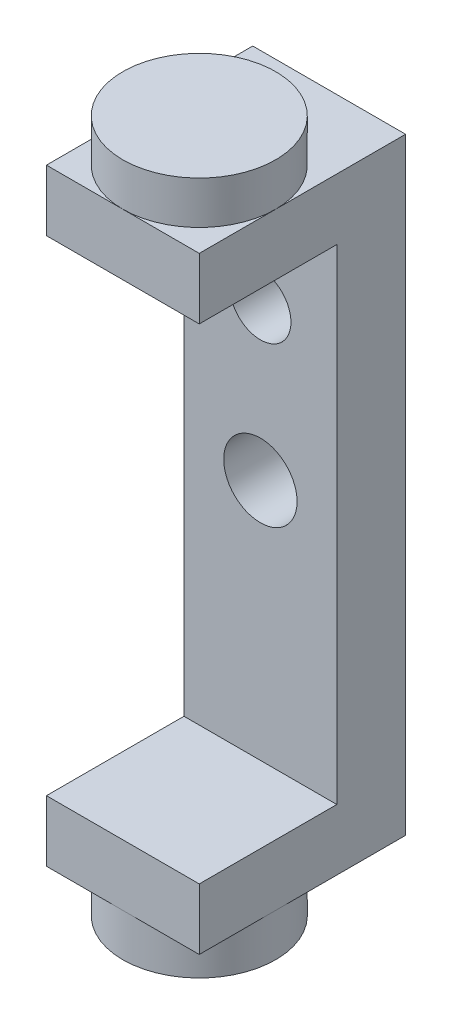
ISO-10303-21;
HEADER;
FILE_DESCRIPTION(('STEP AP214'),'2;1');
FILE_NAME('part.step','',(''),(''),'','','');
FILE_SCHEMA(('AUTOMOTIVE_DESIGN { 1 0 10303 214 1 1 1 1 }'));
ENDSEC;
DATA;
#1=APPLICATION_CONTEXT('core data for automotive mechanical design processes');
#2=APPLICATION_PROTOCOL_DEFINITION('international standard','automotive_design',2000,#1);
#3=PRODUCT_CONTEXT('',#1,'mechanical');
#4=PRODUCT('Part','Part','',(#3));
#5=PRODUCT_RELATED_PRODUCT_CATEGORY('part','',(#4));
#6=PRODUCT_DEFINITION_FORMATION('','',#4);
#7=PRODUCT_DEFINITION_CONTEXT('part definition',#1,'design');
#8=PRODUCT_DEFINITION('design','',#6,#7);
#9=PRODUCT_DEFINITION_SHAPE('','',#8);
#10=(LENGTH_UNIT() NAMED_UNIT(*) SI_UNIT(.MILLI.,.METRE.));
#11=(NAMED_UNIT(*) PLANE_ANGLE_UNIT() SI_UNIT($,.RADIAN.));
#12=(NAMED_UNIT(*) SI_UNIT($,.STERADIAN.) SOLID_ANGLE_UNIT());
#13=UNCERTAINTY_MEASURE_WITH_UNIT(LENGTH_MEASURE(1.E-05),#10,'distance_accuracy_value','');
#14=(GEOMETRIC_REPRESENTATION_CONTEXT(3) GLOBAL_UNCERTAINTY_ASSIGNED_CONTEXT((#13)) GLOBAL_UNIT_ASSIGNED_CONTEXT((#10,
#11,#12)) REPRESENTATION_CONTEXT('',''));
#15=CARTESIAN_POINT('',(0.,0.,0.));
#16=DIRECTION('',(0.,0.,1.));
#17=DIRECTION('',(1.,0.,0.));
#18=AXIS2_PLACEMENT_3D('',#15,#16,#17);
#19=CARTESIAN_POINT('',(2.5,-9.93292427062988,2.25));
#20=DIRECTION('',(0.,1.,0.));
#21=DIRECTION('',(0.,0.,1.));
#22=AXIS2_PLACEMENT_3D('',#19,#20,#21);
#23=PLANE('',#22);
#24=DIRECTION('',(1.,0.,0.));
#25=VECTOR('',#24,1.);
#26=CARTESIAN_POINT('',(2.5,-9.93292427062988,6.75));
#27=LINE('',#26,#25);
#28=CARTESIAN_POINT('',(0.,-9.93292427062988,6.75));
#29=VERTEX_POINT('',#28);
#30=CARTESIAN_POINT('',(2.5,-9.93292427062988,6.75));
#31=VERTEX_POINT('',#30);
#32=EDGE_CURVE('E133',#29,#31,#27,.T.);
#33=ORIENTED_EDGE('',*,*,#32,.F.);
#34=CARTESIAN_POINT('',(0.,-9.93292427062988,4.25));
#35=DIRECTION('',(0.,1.,0.));
#36=DIRECTION('',(0.,0.,1.));
#37=AXIS2_PLACEMENT_3D('',#34,#35,#36);
#38=CIRCLE('',#37,2.5);
#39=CARTESIAN_POINT('',(2.5,-9.93292427062988,4.25));
#40=VERTEX_POINT('',#39);
#41=EDGE_CURVE('E51',#29,#40,#38,.T.);
#42=ORIENTED_EDGE('',*,*,#41,.T.);
#43=DIRECTION('',(0.,0.,-1.));
#44=VECTOR('',#43,1.);
#45=CARTESIAN_POINT('',(2.5,-9.93292427062988,2.25));
#46=LINE('',#45,#44);
#47=EDGE_CURVE('E131',#31,#40,#46,.T.);
#48=ORIENTED_EDGE('',*,*,#47,.F.);
#49=EDGE_LOOP('',(#33,#42,#48));
#50=FACE_BOUND('',#49,.T.);
#51=ADVANCED_FACE('F39',(#50),#23,.F.);
#52=CARTESIAN_POINT('',(2.5,-9.93292427062988,0.));
#53=VERTEX_POINT('',#52);
#54=EDGE_CURVE('E138',#40,#53,#46,.T.);
#55=ORIENTED_EDGE('',*,*,#54,.F.);
#56=CARTESIAN_POINT('',(-2.5,-9.93292427062988,4.25));
#57=VERTEX_POINT('',#56);
#58=EDGE_CURVE('E11',#40,#57,#38,.T.);
#59=ORIENTED_EDGE('',*,*,#58,.T.);
#60=DIRECTION('',(0.,0.,-1.));
#61=VECTOR('',#60,1.);
#62=CARTESIAN_POINT('',(-2.5,-9.93292427062988,2.25));
#63=LINE('',#62,#61);
#64=CARTESIAN_POINT('',(-2.5,-9.93292427062988,0.));
#65=VERTEX_POINT('',#64);
#66=EDGE_CURVE('E152',#57,#65,#63,.T.);
#67=ORIENTED_EDGE('',*,*,#66,.T.);
#68=DIRECTION('',(1.,0.,0.));
#69=VECTOR('',#68,1.);
#70=CARTESIAN_POINT('',(2.5,-9.93292427062988,0.));
#71=LINE('',#70,#69);
#72=EDGE_CURVE('E141',#65,#53,#71,.T.);
#73=ORIENTED_EDGE('',*,*,#72,.T.);
#74=EDGE_LOOP('',(#55,#59,#67,#73));
#75=FACE_BOUND('',#74,.T.);
#76=ADVANCED_FACE('F139',(#75),#23,.F.);
#77=CARTESIAN_POINT('',(2.5,9.93292427062988,2.25));
#78=DIRECTION('',(0.,-1.,0.));
#79=DIRECTION('',(0.,0.,-1.));
#80=AXIS2_PLACEMENT_3D('',#77,#78,#79);
#81=PLANE('',#80);
#82=CARTESIAN_POINT('',(0.,9.93292427062988,4.25));
#83=DIRECTION('',(0.,1.,0.));
#84=DIRECTION('',(0.,0.,1.));
#85=AXIS2_PLACEMENT_3D('',#82,#83,#84);
#86=CIRCLE('',#85,2.5);
#87=CARTESIAN_POINT('',(0.,9.93292427062988,6.75));
#88=VERTEX_POINT('',#87);
#89=CARTESIAN_POINT('',(2.5,9.93292427062988,4.25));
#90=VERTEX_POINT('',#89);
#91=EDGE_CURVE('E261',#88,#90,#86,.T.);
#92=ORIENTED_EDGE('',*,*,#91,.F.);
#93=DIRECTION('',(-1.,0.,0.));
#94=VECTOR('',#93,1.);
#95=CARTESIAN_POINT('',(2.5,9.93292427062988,6.75));
#96=LINE('',#95,#94);
#97=CARTESIAN_POINT('',(2.5,9.93292427062988,6.75));
#98=VERTEX_POINT('',#97);
#99=EDGE_CURVE('E230',#98,#88,#96,.T.);
#100=ORIENTED_EDGE('',*,*,#99,.F.);
#101=DIRECTION('',(0.,0.,-1.));
#102=VECTOR('',#101,1.);
#103=CARTESIAN_POINT('',(2.5,9.93292427062988,2.25));
#104=LINE('',#103,#102);
#105=EDGE_CURVE('E43',#98,#90,#104,.T.);
#106=ORIENTED_EDGE('',*,*,#105,.T.);
#107=EDGE_LOOP('',(#92,#100,#106));
#108=FACE_BOUND('',#107,.T.);
#109=ADVANCED_FACE('F288',(#108),#81,.F.);
#110=CARTESIAN_POINT('',(-2.5,9.93292427062988,4.25));
#111=VERTEX_POINT('',#110);
#112=EDGE_CURVE('E65',#90,#111,#86,.T.);
#113=ORIENTED_EDGE('',*,*,#112,.F.);
#114=CARTESIAN_POINT('',(2.5,9.93292427062988,0.));
#115=VERTEX_POINT('',#114);
#116=EDGE_CURVE('E164',#90,#115,#104,.T.);
#117=ORIENTED_EDGE('',*,*,#116,.T.);
#118=DIRECTION('',(-1.,0.,0.));
#119=VECTOR('',#118,1.);
#120=CARTESIAN_POINT('',(2.5,9.93292427062988,0.));
#121=LINE('',#120,#119);
#122=CARTESIAN_POINT('',(-2.5,9.93292427062988,0.));
#123=VERTEX_POINT('',#122);
#124=EDGE_CURVE('E176',#115,#123,#121,.T.);
#125=ORIENTED_EDGE('',*,*,#124,.T.);
#126=DIRECTION('',(0.,0.,-1.));
#127=VECTOR('',#126,1.);
#128=CARTESIAN_POINT('',(-2.5,9.93292427062988,2.25));
#129=LINE('',#128,#127);
#130=EDGE_CURVE('E160',#111,#123,#129,.T.);
#131=ORIENTED_EDGE('',*,*,#130,.F.);
#132=EDGE_LOOP('',(#113,#117,#125,#131));
#133=FACE_BOUND('',#132,.T.);
#134=ADVANCED_FACE('F177',(#133),#81,.F.);
#135=CARTESIAN_POINT('',(0.,0.,2.25));
#136=DIRECTION('',(0.,0.,-1.));
#137=DIRECTION('',(-1.,0.,0.));
#138=AXIS2_PLACEMENT_3D('',#135,#136,#137);
#139=PLANE('',#138);
#140=CARTESIAN_POINT('',(-3.5312787199579E-08,-2.51143155479815E-08,2.25));
#141=DIRECTION('',(0.,0.,1.));
#142=DIRECTION('',(1.,0.,0.));
#143=AXIS2_PLACEMENT_3D('',#140,#141,#142);
#144=CIRCLE('',#143,1.20000001650841);
#145=CARTESIAN_POINT('',(1.19999998119562,-2.51143155479815E-08,2.25));
#146=VERTEX_POINT('',#145);
#147=EDGE_CURVE('E190',#146,#146,#144,.T.);
#148=ORIENTED_EDGE('',*,*,#147,.F.);
#149=EDGE_LOOP('',(#148));
#150=FACE_BOUND('',#149,.T.);
#151=CARTESIAN_POINT('',(1.04070406819709E-07,4.98252010345459,2.25));
#152=DIRECTION('',(0.,0.,1.));
#153=DIRECTION('',(1.,0.,0.));
#154=AXIS2_PLACEMENT_3D('',#151,#152,#153);
#155=CIRCLE('',#154,1.00000000077066);
#156=CARTESIAN_POINT('',(1.00000010484107,4.98252010345459,2.25));
#157=VERTEX_POINT('',#156);
#158=EDGE_CURVE('E199',#157,#157,#155,.T.);
#159=ORIENTED_EDGE('',*,*,#158,.F.);
#160=EDGE_LOOP('',(#159));
#161=FACE_BOUND('',#160,.T.);
#162=DIRECTION('',(-1.,0.,0.));
#163=VECTOR('',#162,1.);
#164=CARTESIAN_POINT('',(2.5,-7.93292427062988,2.25));
#165=LINE('',#164,#163);
#166=CARTESIAN_POINT('',(2.5,-7.93292427062988,2.25));
#167=VERTEX_POINT('',#166);
#168=CARTESIAN_POINT('',(-2.5,-7.93292427062988,2.25));
#169=VERTEX_POINT('',#168);
#170=EDGE_CURVE('E245',#167,#169,#165,.T.);
#171=ORIENTED_EDGE('',*,*,#170,.F.);
#172=DIRECTION('',(0.,1.,0.));
#173=VECTOR('',#172,1.);
#174=CARTESIAN_POINT('',(2.5,9.93292427062988,2.25));
#175=LINE('',#174,#173);
#176=CARTESIAN_POINT('',(2.5,7.93292427062988,2.25));
#177=VERTEX_POINT('',#176);
#178=EDGE_CURVE('E186',#167,#177,#175,.T.);
#179=ORIENTED_EDGE('',*,*,#178,.T.);
#180=DIRECTION('',(1.,0.,0.));
#181=VECTOR('',#180,1.);
#182=CARTESIAN_POINT('',(2.5,7.93292427062988,2.25));
#183=LINE('',#182,#181);
#184=CARTESIAN_POINT('',(-2.5,7.93292427062988,2.25));
#185=VERTEX_POINT('',#184);
#186=EDGE_CURVE('E219',#185,#177,#183,.T.);
#187=ORIENTED_EDGE('',*,*,#186,.F.);
#188=DIRECTION('',(0.,-1.,0.));
#189=VECTOR('',#188,1.);
#190=CARTESIAN_POINT('',(-2.5,9.93292427062988,2.25));
#191=LINE('',#190,#189);
#192=EDGE_CURVE('E146',#185,#169,#191,.T.);
#193=ORIENTED_EDGE('',*,*,#192,.T.);
#194=EDGE_LOOP('',(#171,#179,#187,#193));
#195=FACE_BOUND('',#194,.T.);
#196=ADVANCED_FACE('F353',(#150,#161,#195),#139,.F.);
#197=CARTESIAN_POINT('',(0.,0.,0.));
#198=DIRECTION('',(0.,0.,-1.));
#199=DIRECTION('',(-1.,0.,0.));
#200=AXIS2_PLACEMENT_3D('',#197,#198,#199);
#201=PLANE('',#200);
#202=CARTESIAN_POINT('',(-3.5312787199579E-08,-2.51143155479815E-08,0.));
#203=DIRECTION('',(0.,0.,1.));
#204=DIRECTION('',(1.,0.,0.));
#205=AXIS2_PLACEMENT_3D('',#202,#203,#204);
#206=CIRCLE('',#205,1.20000001650841);
#207=CARTESIAN_POINT('',(1.19999998119562,-2.51143155479815E-08,0.));
#208=VERTEX_POINT('',#207);
#209=EDGE_CURVE('E195',#208,#208,#206,.T.);
#210=ORIENTED_EDGE('',*,*,#209,.T.);
#211=EDGE_LOOP('',(#210));
#212=FACE_BOUND('',#211,.T.);
#213=DIRECTION('',(0.,1.,0.));
#214=VECTOR('',#213,1.);
#215=CARTESIAN_POINT('',(2.5,9.93292427062988,0.));
#216=LINE('',#215,#214);
#217=EDGE_CURVE('E180',#53,#115,#216,.T.);
#218=ORIENTED_EDGE('',*,*,#217,.F.);
#219=ORIENTED_EDGE('',*,*,#72,.F.);
#220=DIRECTION('',(0.,-1.,0.));
#221=VECTOR('',#220,1.);
#222=CARTESIAN_POINT('',(-2.5,9.93292427062988,0.));
#223=LINE('',#222,#221);
#224=EDGE_CURVE('E174',#123,#65,#223,.T.);
#225=ORIENTED_EDGE('',*,*,#224,.F.);
#226=ORIENTED_EDGE('',*,*,#124,.F.);
#227=EDGE_LOOP('',(#218,#219,#225,#226));
#228=FACE_BOUND('',#227,.T.);
#229=CARTESIAN_POINT('',(1.04070406819709E-07,4.98252010345459,0.));
#230=DIRECTION('',(0.,0.,1.));
#231=DIRECTION('',(1.,0.,0.));
#232=AXIS2_PLACEMENT_3D('',#229,#230,#231);
#233=CIRCLE('',#232,1.00000000077066);
#234=CARTESIAN_POINT('',(1.00000010484107,4.98252010345459,0.));
#235=VERTEX_POINT('',#234);
#236=EDGE_CURVE('E203',#235,#235,#233,.T.);
#237=ORIENTED_EDGE('',*,*,#236,.T.);
#238=EDGE_LOOP('',(#237));
#239=FACE_BOUND('',#238,.T.);
#240=ADVANCED_FACE('F182',(#212,#228,#239),#201,.T.);
#241=CARTESIAN_POINT('',(2.5,9.93292427062988,2.25));
#242=DIRECTION('',(-1.,0.,0.));
#243=DIRECTION('',(0.,0.,1.));
#244=AXIS2_PLACEMENT_3D('',#241,#242,#243);
#245=PLANE('',#244);
#246=ORIENTED_EDGE('',*,*,#217,.T.);
#247=ORIENTED_EDGE('',*,*,#116,.F.);
#248=ORIENTED_EDGE('',*,*,#105,.F.);
#249=DIRECTION('',(0.,1.,0.));
#250=VECTOR('',#249,1.);
#251=CARTESIAN_POINT('',(2.5,9.93292427062988,6.75));
#252=LINE('',#251,#250);
#253=CARTESIAN_POINT('',(2.5,7.93292427062988,6.75));
#254=VERTEX_POINT('',#253);
#255=EDGE_CURVE('E223',#254,#98,#252,.T.);
#256=ORIENTED_EDGE('',*,*,#255,.F.);
#257=DIRECTION('',(0.,0.,-1.));
#258=VECTOR('',#257,1.);
#259=CARTESIAN_POINT('',(2.5,7.93292427062988,6.75));
#260=LINE('',#259,#258);
#261=EDGE_CURVE('E214',#254,#177,#260,.T.);
#262=ORIENTED_EDGE('',*,*,#261,.T.);
#263=ORIENTED_EDGE('',*,*,#178,.F.);
#264=DIRECTION('',(0.,0.,-1.));
#265=VECTOR('',#264,1.);
#266=CARTESIAN_POINT('',(2.5,-7.93292427062988,6.75));
#267=LINE('',#266,#265);
#268=CARTESIAN_POINT('',(2.5,-7.93292427062988,6.75));
#269=VERTEX_POINT('',#268);
#270=EDGE_CURVE('E224',#269,#167,#267,.T.);
#271=ORIENTED_EDGE('',*,*,#270,.F.);
#272=DIRECTION('',(0.,1.,0.));
#273=VECTOR('',#272,1.);
#274=CARTESIAN_POINT('',(2.5,-9.93292427062988,6.75));
#275=LINE('',#274,#273);
#276=EDGE_CURVE('E150',#31,#269,#275,.T.);
#277=ORIENTED_EDGE('',*,*,#276,.F.);
#278=ORIENTED_EDGE('',*,*,#47,.T.);
#279=ORIENTED_EDGE('',*,*,#54,.T.);
#280=EDGE_LOOP('',(#246,#247,#248,#256,#262,#263,#271,#277,#278,#279));
#281=FACE_BOUND('',#280,.T.);
#282=ADVANCED_FACE('F41',(#281),#245,.F.);
#283=EDGE_CURVE('E265',#111,#88,#86,.T.);
#284=ORIENTED_EDGE('',*,*,#283,.F.);
#285=CARTESIAN_POINT('',(-2.5,9.93292427062988,6.75));
#286=VERTEX_POINT('',#285);
#287=EDGE_CURVE('E161',#286,#111,#129,.T.);
#288=ORIENTED_EDGE('',*,*,#287,.F.);
#289=EDGE_CURVE('E233',#88,#286,#96,.T.);
#290=ORIENTED_EDGE('',*,*,#289,.F.);
#291=EDGE_LOOP('',(#284,#288,#290));
#292=FACE_BOUND('',#291,.T.);
#293=ADVANCED_FACE('F301',(#292),#81,.F.);
#294=CARTESIAN_POINT('',(-2.5,9.93292427062988,2.25));
#295=DIRECTION('',(1.,0.,0.));
#296=DIRECTION('',(0.,0.,-1.));
#297=AXIS2_PLACEMENT_3D('',#294,#295,#296);
#298=PLANE('',#297);
#299=ORIENTED_EDGE('',*,*,#224,.T.);
#300=ORIENTED_EDGE('',*,*,#66,.F.);
#301=CARTESIAN_POINT('',(-2.5,-9.93292427062988,6.75));
#302=VERTEX_POINT('',#301);
#303=EDGE_CURVE('E154',#302,#57,#63,.T.);
#304=ORIENTED_EDGE('',*,*,#303,.F.);
#305=DIRECTION('',(0.,-1.,0.));
#306=VECTOR('',#305,1.);
#307=CARTESIAN_POINT('',(-2.5,-9.93292427062988,6.75));
#308=LINE('',#307,#306);
#309=CARTESIAN_POINT('',(-2.5,-7.93292427062988,6.75));
#310=VERTEX_POINT('',#309);
#311=EDGE_CURVE('E252',#310,#302,#308,.T.);
#312=ORIENTED_EDGE('',*,*,#311,.F.);
#313=DIRECTION('',(0.,0.,-1.));
#314=VECTOR('',#313,1.);
#315=CARTESIAN_POINT('',(-2.5,-7.93292427062988,6.75));
#316=LINE('',#315,#314);
#317=EDGE_CURVE('E240',#310,#169,#316,.T.);
#318=ORIENTED_EDGE('',*,*,#317,.T.);
#319=ORIENTED_EDGE('',*,*,#192,.F.);
#320=DIRECTION('',(0.,0.,-1.));
#321=VECTOR('',#320,1.);
#322=CARTESIAN_POINT('',(-2.5,7.93292427062988,6.75));
#323=LINE('',#322,#321);
#324=CARTESIAN_POINT('',(-2.5,7.93292427062988,6.75));
#325=VERTEX_POINT('',#324);
#326=EDGE_CURVE('E207',#325,#185,#323,.T.);
#327=ORIENTED_EDGE('',*,*,#326,.F.);
#328=DIRECTION('',(0.,-1.,0.));
#329=VECTOR('',#328,1.);
#330=CARTESIAN_POINT('',(-2.5,9.93292427062988,6.75));
#331=LINE('',#330,#329);
#332=EDGE_CURVE('E227',#286,#325,#331,.T.);
#333=ORIENTED_EDGE('',*,*,#332,.F.);
#334=ORIENTED_EDGE('',*,*,#287,.T.);
#335=ORIENTED_EDGE('',*,*,#130,.T.);
#336=EDGE_LOOP('',(#299,#300,#304,#312,#318,#319,#327,#333,#334,#335));
#337=FACE_BOUND('',#336,.T.);
#338=ADVANCED_FACE('F172',(#337),#298,.F.);
#339=ORIENTED_EDGE('',*,*,#303,.T.);
#340=EDGE_CURVE('E49',#57,#29,#38,.T.);
#341=ORIENTED_EDGE('',*,*,#340,.T.);
#342=EDGE_CURVE('E244',#302,#29,#27,.T.);
#343=ORIENTED_EDGE('',*,*,#342,.F.);
#344=EDGE_LOOP('',(#339,#341,#343));
#345=FACE_BOUND('',#344,.T.);
#346=ADVANCED_FACE('F284',(#345),#23,.F.);
#347=CARTESIAN_POINT('',(-3.5312787199579E-08,-2.51143155479815E-08,2.25));
#348=DIRECTION('',(0.,0.,-1.));
#349=DIRECTION('',(-1.,0.,0.));
#350=AXIS2_PLACEMENT_3D('',#347,#348,#349);
#351=CYLINDRICAL_SURFACE('',#350,1.20000001650841);
#352=ORIENTED_EDGE('',*,*,#147,.T.);
#353=EDGE_LOOP('',(#352));
#354=FACE_BOUND('',#353,.T.);
#355=ORIENTED_EDGE('',*,*,#209,.F.);
#356=EDGE_LOOP('',(#355));
#357=FACE_BOUND('',#356,.T.);
#358=ADVANCED_FACE('F292',(#354,#357),#351,.F.);
#359=CARTESIAN_POINT('',(1.04070406819709E-07,4.98252010345459,2.25));
#360=DIRECTION('',(0.,0.,-1.));
#361=DIRECTION('',(-1.,0.,0.));
#362=AXIS2_PLACEMENT_3D('',#359,#360,#361);
#363=CYLINDRICAL_SURFACE('',#362,1.00000000077066);
#364=ORIENTED_EDGE('',*,*,#158,.T.);
#365=EDGE_LOOP('',(#364));
#366=FACE_BOUND('',#365,.T.);
#367=ORIENTED_EDGE('',*,*,#236,.F.);
#368=EDGE_LOOP('',(#367));
#369=FACE_BOUND('',#368,.T.);
#370=ADVANCED_FACE('F298',(#366,#369),#363,.F.);
#371=CARTESIAN_POINT('',(2.5,7.93292427062988,6.75));
#372=DIRECTION('',(0.,1.,0.));
#373=DIRECTION('',(0.,0.,1.));
#374=AXIS2_PLACEMENT_3D('',#371,#372,#373);
#375=PLANE('',#374);
#376=ORIENTED_EDGE('',*,*,#186,.T.);
#377=ORIENTED_EDGE('',*,*,#261,.F.);
#378=DIRECTION('',(1.,0.,0.));
#379=VECTOR('',#378,1.);
#380=CARTESIAN_POINT('',(2.5,7.93292427062988,6.75));
#381=LINE('',#380,#379);
#382=EDGE_CURVE('E218',#325,#254,#381,.T.);
#383=ORIENTED_EDGE('',*,*,#382,.F.);
#384=ORIENTED_EDGE('',*,*,#326,.T.);
#385=EDGE_LOOP('',(#376,#377,#383,#384));
#386=FACE_BOUND('',#385,.T.);
#387=ADVANCED_FACE('F314',(#386),#375,.F.);
#388=CARTESIAN_POINT('',(0.,0.,6.75));
#389=DIRECTION('',(0.,0.,-1.));
#390=DIRECTION('',(-1.,0.,0.));
#391=AXIS2_PLACEMENT_3D('',#388,#389,#390);
#392=PLANE('',#391);
#393=ORIENTED_EDGE('',*,*,#255,.T.);
#394=ORIENTED_EDGE('',*,*,#99,.T.);
#395=ORIENTED_EDGE('',*,*,#289,.T.);
#396=ORIENTED_EDGE('',*,*,#332,.T.);
#397=ORIENTED_EDGE('',*,*,#382,.T.);
#398=EDGE_LOOP('',(#393,#394,#395,#396,#397));
#399=FACE_BOUND('',#398,.T.);
#400=ADVANCED_FACE('F318',(#399),#392,.F.);
#401=CARTESIAN_POINT('',(2.5,-7.93292427062988,6.75));
#402=DIRECTION('',(0.,-1.,0.));
#403=DIRECTION('',(0.,0.,-1.));
#404=AXIS2_PLACEMENT_3D('',#401,#402,#403);
#405=PLANE('',#404);
#406=ORIENTED_EDGE('',*,*,#170,.T.);
#407=ORIENTED_EDGE('',*,*,#317,.F.);
#408=DIRECTION('',(-1.,0.,0.));
#409=VECTOR('',#408,1.);
#410=CARTESIAN_POINT('',(2.5,-7.93292427062988,6.75));
#411=LINE('',#410,#409);
#412=EDGE_CURVE('E256',#269,#310,#411,.T.);
#413=ORIENTED_EDGE('',*,*,#412,.F.);
#414=ORIENTED_EDGE('',*,*,#270,.T.);
#415=EDGE_LOOP('',(#406,#407,#413,#414));
#416=FACE_BOUND('',#415,.T.);
#417=ADVANCED_FACE('F308',(#416),#405,.F.);
#418=CARTESIAN_POINT('',(0.,0.,6.75));
#419=DIRECTION('',(0.,0.,1.));
#420=DIRECTION('',(1.,0.,0.));
#421=AXIS2_PLACEMENT_3D('',#418,#419,#420);
#422=PLANE('',#421);
#423=ORIENTED_EDGE('',*,*,#276,.T.);
#424=ORIENTED_EDGE('',*,*,#412,.T.);
#425=ORIENTED_EDGE('',*,*,#311,.T.);
#426=ORIENTED_EDGE('',*,*,#342,.T.);
#427=ORIENTED_EDGE('',*,*,#32,.T.);
#428=EDGE_LOOP('',(#423,#424,#425,#426,#427));
#429=FACE_BOUND('',#428,.T.);
#430=ADVANCED_FACE('F305',(#429),#422,.T.);
#431=CARTESIAN_POINT('',(0.,11.3329242706299,4.25));
#432=DIRECTION('',(0.,-1.,0.));
#433=DIRECTION('',(0.,0.,-1.));
#434=AXIS2_PLACEMENT_3D('',#431,#432,#433);
#435=CYLINDRICAL_SURFACE('',#434,2.5);
#436=CARTESIAN_POINT('',(0.,11.3329242706299,4.25));
#437=DIRECTION('',(0.,1.,0.));
#438=DIRECTION('',(0.,0.,1.));
#439=AXIS2_PLACEMENT_3D('',#436,#437,#438);
#440=CIRCLE('',#439,2.5);
#441=CARTESIAN_POINT('',(0.,11.3329242706299,6.75));
#442=VERTEX_POINT('',#441);
#443=EDGE_CURVE('E249',#442,#442,#440,.T.);
#444=ORIENTED_EDGE('',*,*,#443,.F.);
#445=EDGE_LOOP('',(#444));
#446=FACE_BOUND('',#445,.T.);
#447=ORIENTED_EDGE('',*,*,#91,.T.);
#448=ORIENTED_EDGE('',*,*,#112,.T.);
#449=ORIENTED_EDGE('',*,*,#283,.T.);
#450=EDGE_LOOP('',(#447,#448,#449));
#451=FACE_BOUND('',#450,.T.);
#452=ADVANCED_FACE('F331',(#446,#451),#435,.T.);
#453=CARTESIAN_POINT('',(0.,11.3329242706299,4.25));
#454=DIRECTION('',(0.,1.,0.));
#455=DIRECTION('',(0.,0.,1.));
#456=AXIS2_PLACEMENT_3D('',#453,#454,#455);
#457=PLANE('',#456);
#458=ORIENTED_EDGE('',*,*,#443,.T.);
#459=EDGE_LOOP('',(#458));
#460=FACE_BOUND('',#459,.T.);
#461=ADVANCED_FACE('F280',(#460),#457,.T.);
#462=CARTESIAN_POINT('',(0.,-11.3329242706299,4.25));
#463=DIRECTION('',(0.,1.,0.));
#464=DIRECTION('',(0.,0.,1.));
#465=AXIS2_PLACEMENT_3D('',#462,#463,#464);
#466=CYLINDRICAL_SURFACE('',#465,2.5);
#467=CARTESIAN_POINT('',(0.,-11.3329242706299,4.25));
#468=DIRECTION('',(0.,1.,0.));
#469=DIRECTION('',(0.,0.,1.));
#470=AXIS2_PLACEMENT_3D('',#467,#468,#469);
#471=CIRCLE('',#470,2.5);
#472=CARTESIAN_POINT('',(0.,-11.3329242706299,6.75));
#473=VERTEX_POINT('',#472);
#474=EDGE_CURVE('E136',#473,#473,#471,.T.);
#475=ORIENTED_EDGE('',*,*,#474,.T.);
#476=EDGE_LOOP('',(#475));
#477=FACE_BOUND('',#476,.T.);
#478=ORIENTED_EDGE('',*,*,#41,.F.);
#479=ORIENTED_EDGE('',*,*,#340,.F.);
#480=ORIENTED_EDGE('',*,*,#58,.F.);
#481=EDGE_LOOP('',(#478,#479,#480));
#482=FACE_BOUND('',#481,.T.);
#483=ADVANCED_FACE('F123',(#477,#482),#466,.T.);
#484=CARTESIAN_POINT('',(0.,-11.3329242706299,4.25));
#485=DIRECTION('',(0.,-1.,0.));
#486=DIRECTION('',(0.,0.,1.));
#487=AXIS2_PLACEMENT_3D('',#484,#485,#486);
#488=PLANE('',#487);
#489=ORIENTED_EDGE('',*,*,#474,.F.);
#490=EDGE_LOOP('',(#489));
#491=FACE_BOUND('',#490,.T.);
#492=ADVANCED_FACE('F274',(#491),#488,.T.);
#493=CLOSED_SHELL('',(#51,#76,#109,#134,#196,#240,#282,#293,#338,#346,#358,#370,#387,#400,#417,
#430,#452,#461,#483,#492));
#494=MANIFOLD_SOLID_BREP('B2',#493);
#495=ADVANCED_BREP_SHAPE_REPRESENTATION('',(#18,#494),#14);
#496=SHAPE_DEFINITION_REPRESENTATION(#9,#495);
ENDSEC;
END-ISO-10303-21;
